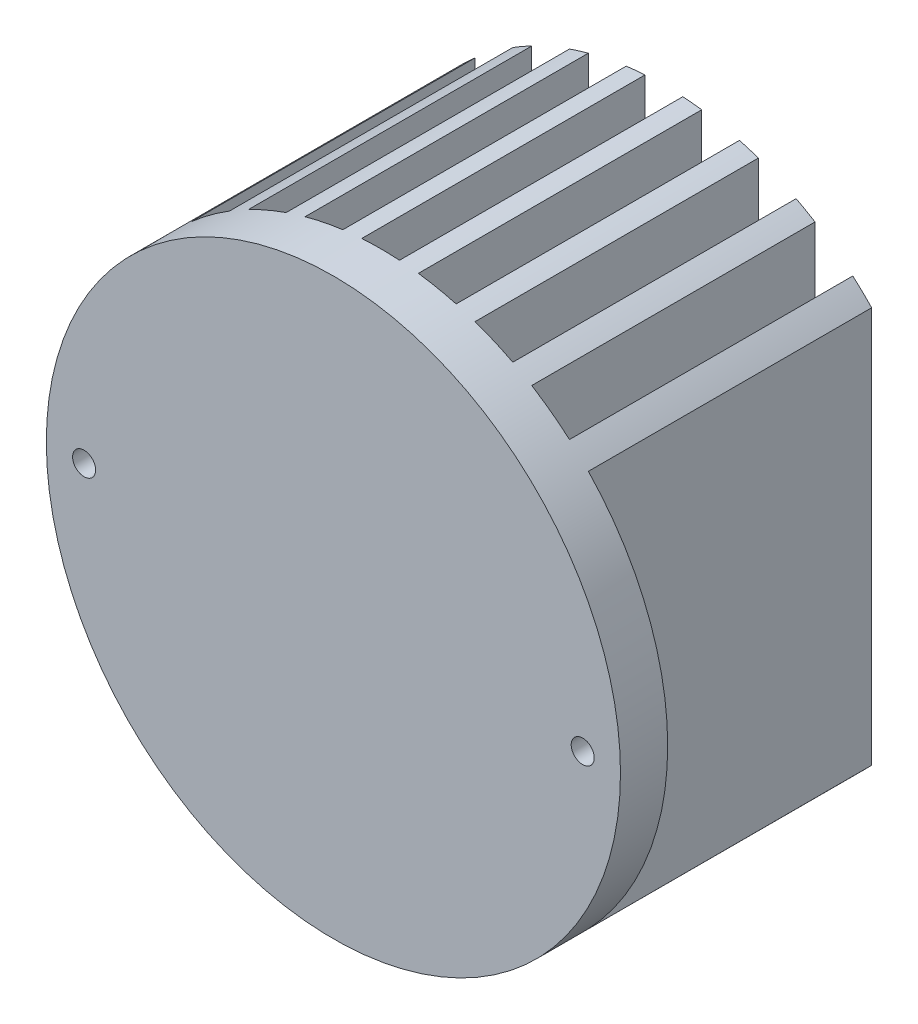
ISO-10303-21;
HEADER;
FILE_DESCRIPTION(('STEP AP214'),'2;1');
FILE_NAME('part.step','',(''),(''),'','','');
FILE_SCHEMA(('AUTOMOTIVE_DESIGN { 1 0 10303 214 1 1 1 1 }'));
ENDSEC;
DATA;
#1=APPLICATION_CONTEXT('core data for automotive mechanical design processes');
#2=APPLICATION_PROTOCOL_DEFINITION('international standard','automotive_design',2000,#1);
#3=PRODUCT_CONTEXT('',#1,'mechanical');
#4=PRODUCT('Part','Part','',(#3));
#5=PRODUCT_RELATED_PRODUCT_CATEGORY('part','',(#4));
#6=PRODUCT_DEFINITION_FORMATION('','',#4);
#7=PRODUCT_DEFINITION_CONTEXT('part definition',#1,'design');
#8=PRODUCT_DEFINITION('design','',#6,#7);
#9=PRODUCT_DEFINITION_SHAPE('','',#8);
#10=(LENGTH_UNIT() NAMED_UNIT(*) SI_UNIT(.MILLI.,.METRE.));
#11=(NAMED_UNIT(*) PLANE_ANGLE_UNIT() SI_UNIT($,.RADIAN.));
#12=(NAMED_UNIT(*) SI_UNIT($,.STERADIAN.) SOLID_ANGLE_UNIT());
#13=UNCERTAINTY_MEASURE_WITH_UNIT(LENGTH_MEASURE(1.E-05),#10,'distance_accuracy_value','');
#14=(GEOMETRIC_REPRESENTATION_CONTEXT(3) GLOBAL_UNCERTAINTY_ASSIGNED_CONTEXT((#13)) GLOBAL_UNIT_ASSIGNED_CONTEXT((#10,
#11,#12)) REPRESENTATION_CONTEXT('',''));
#15=CARTESIAN_POINT('',(0.,0.,0.));
#16=DIRECTION('',(0.,0.,1.));
#17=DIRECTION('',(1.,0.,0.));
#18=AXIS2_PLACEMENT_3D('',#15,#16,#17);
#19=CARTESIAN_POINT('',(0.,0.,35.));
#20=DIRECTION('',(0.,0.,-1.));
#21=DIRECTION('',(-1.,0.,0.));
#22=AXIS2_PLACEMENT_3D('',#19,#20,#21);
#23=CYLINDRICAL_SURFACE('',#22,30.4);
#24=CARTESIAN_POINT('',(0.,0.,35.));
#25=DIRECTION('',(0.,0.,1.));
#26=DIRECTION('',(1.,0.,0.));
#27=AXIS2_PLACEMENT_3D('',#24,#25,#26);
#28=CIRCLE('',#27,30.4);
#29=CARTESIAN_POINT('',(30.4,0.,35.));
#30=VERTEX_POINT('',#29);
#31=EDGE_CURVE('E296',#30,#30,#28,.T.);
#32=ORIENTED_EDGE('',*,*,#31,.F.);
#33=EDGE_LOOP('',(#32));
#34=FACE_BOUND('',#33,.T.);
#35=CARTESIAN_POINT('',(0.,0.,30.));
#36=DIRECTION('',(0.,0.,-1.));
#37=DIRECTION('',(-1.,0.,0.));
#38=AXIS2_PLACEMENT_3D('',#35,#36,#37);
#39=CIRCLE('',#38,30.4);
#40=CARTESIAN_POINT('',(22.,20.9799904671094,30.));
#41=VERTEX_POINT('',#40);
#42=CARTESIAN_POINT('',(22.,-20.9799904671094,30.));
#43=VERTEX_POINT('',#42);
#44=EDGE_CURVE('E338',#41,#43,#39,.T.);
#45=ORIENTED_EDGE('',*,*,#44,.F.);
#46=DIRECTION('',(0.,0.,-1.));
#47=VECTOR('',#46,1.);
#48=CARTESIAN_POINT('',(22.,20.9799904671094,35.));
#49=LINE('',#48,#47);
#50=CARTESIAN_POINT('',(22.,20.9799904671094,0.));
#51=VERTEX_POINT('',#50);
#52=EDGE_CURVE('E528',#41,#51,#49,.T.);
#53=ORIENTED_EDGE('',*,*,#52,.T.);
#54=CARTESIAN_POINT('',(0.,0.,0.));
#55=DIRECTION('',(0.,0.,1.));
#56=DIRECTION('',(1.,0.,0.));
#57=AXIS2_PLACEMENT_3D('',#54,#55,#56);
#58=CIRCLE('',#57,30.4);
#59=CARTESIAN_POINT('',(20.,22.8945408340067,0.));
#60=VERTEX_POINT('',#59);
#61=EDGE_CURVE('E444',#51,#60,#58,.T.);
#62=ORIENTED_EDGE('',*,*,#61,.T.);
#63=DIRECTION('',(0.,0.,-1.));
#64=VECTOR('',#63,1.);
#65=CARTESIAN_POINT('',(20.,22.8945408340067,35.));
#66=LINE('',#65,#64);
#67=CARTESIAN_POINT('',(20.,22.8945408340067,30.));
#68=VERTEX_POINT('',#67);
#69=EDGE_CURVE('E525',#60,#68,#66,.F.);
#70=ORIENTED_EDGE('',*,*,#69,.T.);
#71=CARTESIAN_POINT('',(0.,0.,30.));
#72=DIRECTION('',(0.,0.,-1.));
#73=DIRECTION('',(-1.,0.,0.));
#74=AXIS2_PLACEMENT_3D('',#71,#72,#73);
#75=CIRCLE('',#74,30.4);
#76=CARTESIAN_POINT('',(16.,25.8487910742456,30.));
#77=VERTEX_POINT('',#76);
#78=EDGE_CURVE('E344',#77,#68,#75,.T.);
#79=ORIENTED_EDGE('',*,*,#78,.F.);
#80=DIRECTION('',(0.,0.,-1.));
#81=VECTOR('',#80,1.);
#82=CARTESIAN_POINT('',(16.,25.8487910742456,35.));
#83=LINE('',#82,#81);
#84=CARTESIAN_POINT('',(16.,25.8487910742456,0.));
#85=VERTEX_POINT('',#84);
#86=EDGE_CURVE('E516',#77,#85,#83,.T.);
#87=ORIENTED_EDGE('',*,*,#86,.T.);
#88=CARTESIAN_POINT('',(14.,26.9844399608367,0.));
#89=VERTEX_POINT('',#88);
#90=EDGE_CURVE('E450',#85,#89,#58,.T.);
#91=ORIENTED_EDGE('',*,*,#90,.T.);
#92=DIRECTION('',(0.,0.,-1.));
#93=VECTOR('',#92,1.);
#94=CARTESIAN_POINT('',(14.,26.9844399608367,35.));
#95=LINE('',#94,#93);
#96=CARTESIAN_POINT('',(14.,26.9844399608367,30.));
#97=VERTEX_POINT('',#96);
#98=EDGE_CURVE('E513',#89,#97,#95,.F.);
#99=ORIENTED_EDGE('',*,*,#98,.T.);
#100=CARTESIAN_POINT('',(0.,0.,30.));
#101=DIRECTION('',(0.,0.,-1.));
#102=DIRECTION('',(-1.,0.,0.));
#103=AXIS2_PLACEMENT_3D('',#100,#101,#102);
#104=CIRCLE('',#103,30.4);
#105=CARTESIAN_POINT('',(10.,28.708186985597,30.));
#106=VERTEX_POINT('',#105);
#107=EDGE_CURVE('E348',#106,#97,#104,.T.);
#108=ORIENTED_EDGE('',*,*,#107,.F.);
#109=DIRECTION('',(0.,0.,-1.));
#110=VECTOR('',#109,1.);
#111=CARTESIAN_POINT('',(10.,28.708186985597,35.));
#112=LINE('',#111,#110);
#113=CARTESIAN_POINT('',(10.,28.708186985597,0.));
#114=VERTEX_POINT('',#113);
#115=EDGE_CURVE('E504',#106,#114,#112,.T.);
#116=ORIENTED_EDGE('',*,*,#115,.T.);
#117=CARTESIAN_POINT('',(8.,29.3284844477174,0.));
#118=VERTEX_POINT('',#117);
#119=EDGE_CURVE('E456',#114,#118,#58,.T.);
#120=ORIENTED_EDGE('',*,*,#119,.T.);
#121=DIRECTION('',(0.,0.,-1.));
#122=VECTOR('',#121,1.);
#123=CARTESIAN_POINT('',(8.,29.3284844477174,35.));
#124=LINE('',#123,#122);
#125=CARTESIAN_POINT('',(8.,29.3284844477174,30.));
#126=VERTEX_POINT('',#125);
#127=EDGE_CURVE('E501',#118,#126,#124,.F.);
#128=ORIENTED_EDGE('',*,*,#127,.T.);
#129=CARTESIAN_POINT('',(0.,0.,30.));
#130=DIRECTION('',(0.,0.,-1.));
#131=DIRECTION('',(-1.,0.,0.));
#132=AXIS2_PLACEMENT_3D('',#129,#130,#131);
#133=CIRCLE('',#132,30.4);
#134=CARTESIAN_POINT('',(4.,30.1356931229398,30.));
#135=VERTEX_POINT('',#134);
#136=EDGE_CURVE('E352',#135,#126,#133,.T.);
#137=ORIENTED_EDGE('',*,*,#136,.F.);
#138=DIRECTION('',(0.,0.,-1.));
#139=VECTOR('',#138,1.);
#140=CARTESIAN_POINT('',(4.,30.1356931229398,35.));
#141=LINE('',#140,#139);
#142=CARTESIAN_POINT('',(4.,30.1356931229398,0.));
#143=VERTEX_POINT('',#142);
#144=EDGE_CURVE('E491',#135,#143,#141,.T.);
#145=ORIENTED_EDGE('',*,*,#144,.T.);
#146=CARTESIAN_POINT('',(2.,30.3341391834349,0.));
#147=VERTEX_POINT('',#146);
#148=EDGE_CURVE('E429',#143,#147,#58,.T.);
#149=ORIENTED_EDGE('',*,*,#148,.T.);
#150=DIRECTION('',(0.,0.,-1.));
#151=VECTOR('',#150,1.);
#152=CARTESIAN_POINT('',(2.,30.3341391834349,35.));
#153=LINE('',#152,#151);
#154=CARTESIAN_POINT('',(2.,30.3341391834349,30.));
#155=VERTEX_POINT('',#154);
#156=EDGE_CURVE('E480',#147,#155,#153,.F.);
#157=ORIENTED_EDGE('',*,*,#156,.T.);
#158=CARTESIAN_POINT('',(0.,0.,30.));
#159=DIRECTION('',(0.,0.,-1.));
#160=DIRECTION('',(-1.,0.,0.));
#161=AXIS2_PLACEMENT_3D('',#158,#159,#160);
#162=CIRCLE('',#161,30.4);
#163=CARTESIAN_POINT('',(-2.,30.3341391834349,30.));
#164=VERTEX_POINT('',#163);
#165=EDGE_CURVE('E309',#164,#155,#162,.T.);
#166=ORIENTED_EDGE('',*,*,#165,.F.);
#167=DIRECTION('',(0.,0.,-1.));
#168=VECTOR('',#167,1.);
#169=CARTESIAN_POINT('',(-2.,30.3341391834349,35.));
#170=LINE('',#169,#168);
#171=CARTESIAN_POINT('',(-2.,30.3341391834349,0.));
#172=VERTEX_POINT('',#171);
#173=EDGE_CURVE('E421',#164,#172,#170,.T.);
#174=ORIENTED_EDGE('',*,*,#173,.T.);
#175=CARTESIAN_POINT('',(-4.,30.1356931229398,0.));
#176=VERTEX_POINT('',#175);
#177=EDGE_CURVE('E295',#172,#176,#58,.T.);
#178=ORIENTED_EDGE('',*,*,#177,.T.);
#179=DIRECTION('',(0.,0.,-1.));
#180=VECTOR('',#179,1.);
#181=CARTESIAN_POINT('',(-4.,30.1356931229398,35.));
#182=LINE('',#181,#180);
#183=CARTESIAN_POINT('',(-4.,30.1356931229398,30.));
#184=VERTEX_POINT('',#183);
#185=EDGE_CURVE('E11',#184,#176,#182,.T.);
#186=ORIENTED_EDGE('',*,*,#185,.F.);
#187=CARTESIAN_POINT('',(0.,0.,30.));
#188=DIRECTION('',(0.,0.,-1.));
#189=DIRECTION('',(-1.,0.,0.));
#190=AXIS2_PLACEMENT_3D('',#187,#188,#189);
#191=CIRCLE('',#190,30.4);
#192=CARTESIAN_POINT('',(-8.,29.3284844477174,30.));
#193=VERTEX_POINT('',#192);
#194=EDGE_CURVE('E394',#193,#184,#191,.T.);
#195=ORIENTED_EDGE('',*,*,#194,.F.);
#196=DIRECTION('',(0.,0.,-1.));
#197=VECTOR('',#196,1.);
#198=CARTESIAN_POINT('',(-8.,29.3284844477174,35.));
#199=LINE('',#198,#197);
#200=CARTESIAN_POINT('',(-8.,29.3284844477174,0.));
#201=VERTEX_POINT('',#200);
#202=EDGE_CURVE('E53',#201,#193,#199,.F.);
#203=ORIENTED_EDGE('',*,*,#202,.F.);
#204=CARTESIAN_POINT('',(-10.,28.708186985597,0.));
#205=VERTEX_POINT('',#204);
#206=EDGE_CURVE('E424',#201,#205,#58,.T.);
#207=ORIENTED_EDGE('',*,*,#206,.T.);
#208=DIRECTION('',(0.,0.,-1.));
#209=VECTOR('',#208,1.);
#210=CARTESIAN_POINT('',(-10.,28.708186985597,35.));
#211=LINE('',#210,#209);
#212=CARTESIAN_POINT('',(-10.,28.708186985597,30.));
#213=VERTEX_POINT('',#212);
#214=EDGE_CURVE('E387',#213,#205,#211,.T.);
#215=ORIENTED_EDGE('',*,*,#214,.F.);
#216=CARTESIAN_POINT('',(0.,0.,30.));
#217=DIRECTION('',(0.,0.,-1.));
#218=DIRECTION('',(-1.,0.,0.));
#219=AXIS2_PLACEMENT_3D('',#216,#217,#218);
#220=CIRCLE('',#219,30.4);
#221=CARTESIAN_POINT('',(-14.,26.9844399608367,30.));
#222=VERTEX_POINT('',#221);
#223=EDGE_CURVE('E378',#222,#213,#220,.T.);
#224=ORIENTED_EDGE('',*,*,#223,.F.);
#225=DIRECTION('',(0.,0.,-1.));
#226=VECTOR('',#225,1.);
#227=CARTESIAN_POINT('',(-14.,26.9844399608367,35.));
#228=LINE('',#227,#226);
#229=CARTESIAN_POINT('',(-14.,26.9844399608367,0.));
#230=VERTEX_POINT('',#229);
#231=EDGE_CURVE('E384',#230,#222,#228,.F.);
#232=ORIENTED_EDGE('',*,*,#231,.F.);
#233=CARTESIAN_POINT('',(-16.,25.8487910742456,0.));
#234=VERTEX_POINT('',#233);
#235=EDGE_CURVE('E285',#230,#234,#58,.T.);
#236=ORIENTED_EDGE('',*,*,#235,.T.);
#237=DIRECTION('',(0.,0.,-1.));
#238=VECTOR('',#237,1.);
#239=CARTESIAN_POINT('',(-16.,25.8487910742456,35.));
#240=LINE('',#239,#238);
#241=CARTESIAN_POINT('',(-16.,25.8487910742456,30.));
#242=VERTEX_POINT('',#241);
#243=EDGE_CURVE('E371',#242,#234,#240,.T.);
#244=ORIENTED_EDGE('',*,*,#243,.F.);
#245=CARTESIAN_POINT('',(0.,0.,30.));
#246=DIRECTION('',(0.,0.,-1.));
#247=DIRECTION('',(-1.,0.,0.));
#248=AXIS2_PLACEMENT_3D('',#245,#246,#247);
#249=CIRCLE('',#248,30.4);
#250=CARTESIAN_POINT('',(-20.,22.8945408340067,30.));
#251=VERTEX_POINT('',#250);
#252=EDGE_CURVE('E361',#251,#242,#249,.T.);
#253=ORIENTED_EDGE('',*,*,#252,.F.);
#254=DIRECTION('',(0.,0.,-1.));
#255=VECTOR('',#254,1.);
#256=CARTESIAN_POINT('',(-20.,22.8945408340067,35.));
#257=LINE('',#256,#255);
#258=CARTESIAN_POINT('',(-20.,22.8945408340067,0.));
#259=VERTEX_POINT('',#258);
#260=EDGE_CURVE('E368',#259,#251,#257,.F.);
#261=ORIENTED_EDGE('',*,*,#260,.F.);
#262=CARTESIAN_POINT('',(-22.,20.9799904671094,0.));
#263=VERTEX_POINT('',#262);
#264=EDGE_CURVE('E280',#259,#263,#58,.T.);
#265=ORIENTED_EDGE('',*,*,#264,.T.);
#266=DIRECTION('',(0.,0.,-1.));
#267=VECTOR('',#266,1.);
#268=CARTESIAN_POINT('',(-22.,20.9799904671094,35.));
#269=LINE('',#268,#267);
#270=CARTESIAN_POINT('',(-22.,20.9799904671094,30.));
#271=VERTEX_POINT('',#270);
#272=EDGE_CURVE('E260',#271,#263,#269,.T.);
#273=ORIENTED_EDGE('',*,*,#272,.F.);
#274=CARTESIAN_POINT('',(0.,0.,30.));
#275=DIRECTION('',(0.,0.,-1.));
#276=DIRECTION('',(-1.,0.,0.));
#277=AXIS2_PLACEMENT_3D('',#274,#275,#276);
#278=CIRCLE('',#277,30.4);
#279=CARTESIAN_POINT('',(-22.,-20.9799904671094,30.));
#280=VERTEX_POINT('',#279);
#281=EDGE_CURVE('E273',#280,#271,#278,.T.);
#282=ORIENTED_EDGE('',*,*,#281,.F.);
#283=DIRECTION('',(0.,0.,-1.));
#284=VECTOR('',#283,1.);
#285=CARTESIAN_POINT('',(-22.,-20.9799904671094,35.));
#286=LINE('',#285,#284);
#287=CARTESIAN_POINT('',(-22.,-20.9799904671094,0.));
#288=VERTEX_POINT('',#287);
#289=EDGE_CURVE('E257',#288,#280,#286,.F.);
#290=ORIENTED_EDGE('',*,*,#289,.F.);
#291=CARTESIAN_POINT('',(-20.,-22.8945408340067,0.));
#292=VERTEX_POINT('',#291);
#293=EDGE_CURVE('E272',#288,#292,#58,.T.);
#294=ORIENTED_EDGE('',*,*,#293,.T.);
#295=DIRECTION('',(0.,0.,-1.));
#296=VECTOR('',#295,1.);
#297=CARTESIAN_POINT('',(-20.,-22.8945408340067,35.));
#298=LINE('',#297,#296);
#299=CARTESIAN_POINT('',(-20.,-22.8945408340067,30.));
#300=VERTEX_POINT('',#299);
#301=EDGE_CURVE('E360',#300,#292,#298,.T.);
#302=ORIENTED_EDGE('',*,*,#301,.F.);
#303=CARTESIAN_POINT('',(-16.,-25.8487910742456,30.));
#304=VERTEX_POINT('',#303);
#305=EDGE_CURVE('E357',#304,#300,#249,.T.);
#306=ORIENTED_EDGE('',*,*,#305,.F.);
#307=DIRECTION('',(0.,0.,-1.));
#308=VECTOR('',#307,1.);
#309=CARTESIAN_POINT('',(-16.,-25.8487910742456,35.));
#310=LINE('',#309,#308);
#311=CARTESIAN_POINT('',(-16.,-25.8487910742456,0.));
#312=VERTEX_POINT('',#311);
#313=EDGE_CURVE('E364',#312,#304,#310,.F.);
#314=ORIENTED_EDGE('',*,*,#313,.F.);
#315=CARTESIAN_POINT('',(-14.,-26.9844399608367,0.));
#316=VERTEX_POINT('',#315);
#317=EDGE_CURVE('E281',#312,#316,#58,.T.);
#318=ORIENTED_EDGE('',*,*,#317,.T.);
#319=DIRECTION('',(0.,0.,-1.));
#320=VECTOR('',#319,1.);
#321=CARTESIAN_POINT('',(-14.,-26.9844399608367,35.));
#322=LINE('',#321,#320);
#323=CARTESIAN_POINT('',(-14.,-26.9844399608367,30.));
#324=VERTEX_POINT('',#323);
#325=EDGE_CURVE('E377',#324,#316,#322,.T.);
#326=ORIENTED_EDGE('',*,*,#325,.F.);
#327=CARTESIAN_POINT('',(-10.,-28.708186985597,30.));
#328=VERTEX_POINT('',#327);
#329=EDGE_CURVE('E374',#328,#324,#220,.T.);
#330=ORIENTED_EDGE('',*,*,#329,.F.);
#331=DIRECTION('',(0.,0.,-1.));
#332=VECTOR('',#331,1.);
#333=CARTESIAN_POINT('',(-10.,-28.708186985597,35.));
#334=LINE('',#333,#332);
#335=CARTESIAN_POINT('',(-10.,-28.708186985597,0.));
#336=VERTEX_POINT('',#335);
#337=EDGE_CURVE('E381',#336,#328,#334,.F.);
#338=ORIENTED_EDGE('',*,*,#337,.F.);
#339=CARTESIAN_POINT('',(-8.,-29.3284844477174,0.));
#340=VERTEX_POINT('',#339);
#341=EDGE_CURVE('E287',#336,#340,#58,.T.);
#342=ORIENTED_EDGE('',*,*,#341,.T.);
#343=DIRECTION('',(0.,0.,-1.));
#344=VECTOR('',#343,1.);
#345=CARTESIAN_POINT('',(-8.,-29.3284844477174,35.));
#346=LINE('',#345,#344);
#347=CARTESIAN_POINT('',(-8.,-29.3284844477174,30.));
#348=VERTEX_POINT('',#347);
#349=EDGE_CURVE('E393',#348,#340,#346,.T.);
#350=ORIENTED_EDGE('',*,*,#349,.F.);
#351=CARTESIAN_POINT('',(-4.,-30.1356931229398,30.));
#352=VERTEX_POINT('',#351);
#353=EDGE_CURVE('E390',#352,#348,#191,.T.);
#354=ORIENTED_EDGE('',*,*,#353,.F.);
#355=DIRECTION('',(0.,0.,-1.));
#356=VECTOR('',#355,1.);
#357=CARTESIAN_POINT('',(-4.,-30.1356931229398,35.));
#358=LINE('',#357,#356);
#359=CARTESIAN_POINT('',(-4.,-30.1356931229398,0.));
#360=VERTEX_POINT('',#359);
#361=EDGE_CURVE('E397',#360,#352,#358,.F.);
#362=ORIENTED_EDGE('',*,*,#361,.F.);
#363=CARTESIAN_POINT('',(-2.,-30.3341391834349,0.));
#364=VERTEX_POINT('',#363);
#365=EDGE_CURVE('E293',#360,#364,#58,.T.);
#366=ORIENTED_EDGE('',*,*,#365,.T.);
#367=DIRECTION('',(0.,0.,-1.));
#368=VECTOR('',#367,1.);
#369=CARTESIAN_POINT('',(-2.,-30.3341391834349,35.));
#370=LINE('',#369,#368);
#371=CARTESIAN_POINT('',(-2.,-30.3341391834349,30.));
#372=VERTEX_POINT('',#371);
#373=EDGE_CURVE('E471',#364,#372,#370,.F.);
#374=ORIENTED_EDGE('',*,*,#373,.T.);
#375=CARTESIAN_POINT('',(2.,-30.3341391834349,30.));
#376=VERTEX_POINT('',#375);
#377=EDGE_CURVE('E306',#376,#372,#162,.T.);
#378=ORIENTED_EDGE('',*,*,#377,.F.);
#379=DIRECTION('',(0.,0.,-1.));
#380=VECTOR('',#379,1.);
#381=CARTESIAN_POINT('',(2.,-30.3341391834349,35.));
#382=LINE('',#381,#380);
#383=CARTESIAN_POINT('',(2.,-30.3341391834349,0.));
#384=VERTEX_POINT('',#383);
#385=EDGE_CURVE('E474',#376,#384,#382,.T.);
#386=ORIENTED_EDGE('',*,*,#385,.T.);
#387=CARTESIAN_POINT('',(4.,-30.1356931229398,0.));
#388=VERTEX_POINT('',#387);
#389=EDGE_CURVE('E288',#384,#388,#58,.T.);
#390=ORIENTED_EDGE('',*,*,#389,.T.);
#391=DIRECTION('',(0.,0.,-1.));
#392=VECTOR('',#391,1.);
#393=CARTESIAN_POINT('',(4.,-30.1356931229398,35.));
#394=LINE('',#393,#392);
#395=CARTESIAN_POINT('',(4.,-30.1356931229398,30.));
#396=VERTEX_POINT('',#395);
#397=EDGE_CURVE('E494',#388,#396,#394,.F.);
#398=ORIENTED_EDGE('',*,*,#397,.T.);
#399=CARTESIAN_POINT('',(8.,-29.3284844477174,30.));
#400=VERTEX_POINT('',#399);
#401=EDGE_CURVE('E349',#400,#396,#133,.T.);
#402=ORIENTED_EDGE('',*,*,#401,.F.);
#403=DIRECTION('',(0.,0.,-1.));
#404=VECTOR('',#403,1.);
#405=CARTESIAN_POINT('',(8.,-29.3284844477174,35.));
#406=LINE('',#405,#404);
#407=CARTESIAN_POINT('',(8.,-29.3284844477174,0.));
#408=VERTEX_POINT('',#407);
#409=EDGE_CURVE('E498',#400,#408,#406,.T.);
#410=ORIENTED_EDGE('',*,*,#409,.T.);
#411=CARTESIAN_POINT('',(10.,-28.708186985597,0.));
#412=VERTEX_POINT('',#411);
#413=EDGE_CURVE('E294',#408,#412,#58,.T.);
#414=ORIENTED_EDGE('',*,*,#413,.T.);
#415=DIRECTION('',(0.,0.,-1.));
#416=VECTOR('',#415,1.);
#417=CARTESIAN_POINT('',(10.,-28.708186985597,35.));
#418=LINE('',#417,#416);
#419=CARTESIAN_POINT('',(10.,-28.708186985597,30.));
#420=VERTEX_POINT('',#419);
#421=EDGE_CURVE('E507',#412,#420,#418,.F.);
#422=ORIENTED_EDGE('',*,*,#421,.T.);
#423=CARTESIAN_POINT('',(14.,-26.9844399608367,30.));
#424=VERTEX_POINT('',#423);
#425=EDGE_CURVE('E345',#424,#420,#104,.T.);
#426=ORIENTED_EDGE('',*,*,#425,.F.);
#427=DIRECTION('',(0.,0.,-1.));
#428=VECTOR('',#427,1.);
#429=CARTESIAN_POINT('',(14.,-26.9844399608367,35.));
#430=LINE('',#429,#428);
#431=CARTESIAN_POINT('',(14.,-26.9844399608367,0.));
#432=VERTEX_POINT('',#431);
#433=EDGE_CURVE('E510',#424,#432,#430,.T.);
#434=ORIENTED_EDGE('',*,*,#433,.T.);
#435=CARTESIAN_POINT('',(16.,-25.8487910742456,0.));
#436=VERTEX_POINT('',#435);
#437=EDGE_CURVE('E432',#432,#436,#58,.T.);
#438=ORIENTED_EDGE('',*,*,#437,.T.);
#439=DIRECTION('',(0.,0.,-1.));
#440=VECTOR('',#439,1.);
#441=CARTESIAN_POINT('',(16.,-25.8487910742456,35.));
#442=LINE('',#441,#440);
#443=CARTESIAN_POINT('',(16.,-25.8487910742456,30.));
#444=VERTEX_POINT('',#443);
#445=EDGE_CURVE('E519',#436,#444,#442,.F.);
#446=ORIENTED_EDGE('',*,*,#445,.T.);
#447=CARTESIAN_POINT('',(20.,-22.8945408340067,30.));
#448=VERTEX_POINT('',#447);
#449=EDGE_CURVE('E341',#448,#444,#75,.T.);
#450=ORIENTED_EDGE('',*,*,#449,.F.);
#451=DIRECTION('',(0.,0.,-1.));
#452=VECTOR('',#451,1.);
#453=CARTESIAN_POINT('',(20.,-22.8945408340067,35.));
#454=LINE('',#453,#452);
#455=CARTESIAN_POINT('',(20.,-22.8945408340067,0.));
#456=VERTEX_POINT('',#455);
#457=EDGE_CURVE('E522',#448,#456,#454,.T.);
#458=ORIENTED_EDGE('',*,*,#457,.T.);
#459=CARTESIAN_POINT('',(22.,-20.9799904671094,0.));
#460=VERTEX_POINT('',#459);
#461=EDGE_CURVE('E438',#456,#460,#58,.T.);
#462=ORIENTED_EDGE('',*,*,#461,.T.);
#463=DIRECTION('',(0.,0.,-1.));
#464=VECTOR('',#463,1.);
#465=CARTESIAN_POINT('',(22.,-20.9799904671094,35.));
#466=LINE('',#465,#464);
#467=EDGE_CURVE('E531',#460,#43,#466,.F.);
#468=ORIENTED_EDGE('',*,*,#467,.T.);
#469=EDGE_LOOP('',(#45,#53,#62,#70,#79,#87,#91,#99,#108,#116,#120,#128,#137,#145,#149,#157,#166,
#174,#178,#186,#195,#203,#207,#215,#224,#232,#236,#244,#253,#261,#265,#273,#282,#290,#294,#302,
#306,#314,#318,#326,#330,#338,#342,#350,#354,#362,#366,#374,#378,#386,#390,#398,#402,#410,#414,
#422,#426,#434,#438,#446,#450,#458,#462,#468));
#470=FACE_BOUND('',#469,.T.);
#471=ADVANCED_FACE('F45',(#34,#470),#23,.T.);
#472=CARTESIAN_POINT('',(0.,0.,0.));
#473=DIRECTION('',(0.,0.,1.));
#474=DIRECTION('',(1.,0.,0.));
#475=AXIS2_PLACEMENT_3D('',#472,#473,#474);
#476=PLANE('',#475);
#477=DIRECTION('',(0.,1.,0.));
#478=VECTOR('',#477,1.);
#479=CARTESIAN_POINT('',(-4.,-30.4,0.));
#480=LINE('',#479,#478);
#481=EDGE_CURVE('E590',#360,#176,#480,.T.);
#482=ORIENTED_EDGE('',*,*,#481,.T.);
#483=ORIENTED_EDGE('',*,*,#177,.F.);
#484=DIRECTION('',(0.,-1.,0.));
#485=VECTOR('',#484,1.);
#486=CARTESIAN_POINT('',(-2.,0.,0.));
#487=LINE('',#486,#485);
#488=EDGE_CURVE('E302',#172,#364,#487,.T.);
#489=ORIENTED_EDGE('',*,*,#488,.T.);
#490=ORIENTED_EDGE('',*,*,#365,.F.);
#491=EDGE_LOOP('',(#482,#483,#489,#490));
#492=FACE_BOUND('',#491,.T.);
#493=ADVANCED_FACE('F733',(#492),#476,.F.);
#494=DIRECTION('',(0.,-1.,0.));
#495=VECTOR('',#494,1.);
#496=CARTESIAN_POINT('',(-8.,-30.4,0.));
#497=LINE('',#496,#495);
#498=EDGE_CURVE('E415',#201,#340,#497,.T.);
#499=ORIENTED_EDGE('',*,*,#498,.T.);
#500=ORIENTED_EDGE('',*,*,#341,.F.);
#501=DIRECTION('',(0.,1.,0.));
#502=VECTOR('',#501,1.);
#503=CARTESIAN_POINT('',(-10.,-30.4,0.));
#504=LINE('',#503,#502);
#505=EDGE_CURVE('E575',#336,#205,#504,.T.);
#506=ORIENTED_EDGE('',*,*,#505,.T.);
#507=ORIENTED_EDGE('',*,*,#206,.F.);
#508=EDGE_LOOP('',(#499,#500,#506,#507));
#509=FACE_BOUND('',#508,.T.);
#510=ADVANCED_FACE('F738',(#509),#476,.F.);
#511=DIRECTION('',(0.,-1.,0.));
#512=VECTOR('',#511,1.);
#513=CARTESIAN_POINT('',(-14.,-30.4,0.));
#514=LINE('',#513,#512);
#515=EDGE_CURVE('E579',#230,#316,#514,.T.);
#516=ORIENTED_EDGE('',*,*,#515,.T.);
#517=ORIENTED_EDGE('',*,*,#317,.F.);
#518=DIRECTION('',(0.,1.,0.));
#519=VECTOR('',#518,1.);
#520=CARTESIAN_POINT('',(-16.,-30.4,0.));
#521=LINE('',#520,#519);
#522=EDGE_CURVE('E564',#312,#234,#521,.T.);
#523=ORIENTED_EDGE('',*,*,#522,.T.);
#524=ORIENTED_EDGE('',*,*,#235,.F.);
#525=EDGE_LOOP('',(#516,#517,#523,#524));
#526=FACE_BOUND('',#525,.T.);
#527=ADVANCED_FACE('F653',(#526),#476,.F.);
#528=DIRECTION('',(0.,-1.,0.));
#529=VECTOR('',#528,1.);
#530=CARTESIAN_POINT('',(-20.,-30.4,0.));
#531=LINE('',#530,#529);
#532=EDGE_CURVE('E278',#259,#292,#531,.T.);
#533=ORIENTED_EDGE('',*,*,#532,.T.);
#534=ORIENTED_EDGE('',*,*,#293,.F.);
#535=DIRECTION('',(0.,1.,0.));
#536=VECTOR('',#535,1.);
#537=CARTESIAN_POINT('',(-22.,-30.4,0.));
#538=LINE('',#537,#536);
#539=EDGE_CURVE('E253',#288,#263,#538,.T.);
#540=ORIENTED_EDGE('',*,*,#539,.T.);
#541=ORIENTED_EDGE('',*,*,#264,.F.);
#542=EDGE_LOOP('',(#533,#534,#540,#541));
#543=FACE_BOUND('',#542,.T.);
#544=ADVANCED_FACE('F277',(#543),#476,.F.);
#545=ORIENTED_EDGE('',*,*,#148,.F.);
#546=DIRECTION('',(0.,-1.,0.));
#547=VECTOR('',#546,1.);
#548=CARTESIAN_POINT('',(4.,0.,0.));
#549=LINE('',#548,#547);
#550=EDGE_CURVE('E334',#143,#388,#549,.T.);
#551=ORIENTED_EDGE('',*,*,#550,.T.);
#552=ORIENTED_EDGE('',*,*,#389,.F.);
#553=DIRECTION('',(0.,1.,0.));
#554=VECTOR('',#553,1.);
#555=CARTESIAN_POINT('',(2.,0.,0.));
#556=LINE('',#555,#554);
#557=EDGE_CURVE('E298',#384,#147,#556,.T.);
#558=ORIENTED_EDGE('',*,*,#557,.T.);
#559=EDGE_LOOP('',(#545,#551,#552,#558));
#560=FACE_BOUND('',#559,.T.);
#561=ADVANCED_FACE('F677',(#560),#476,.F.);
#562=ORIENTED_EDGE('',*,*,#413,.F.);
#563=DIRECTION('',(0.,1.,0.));
#564=VECTOR('',#563,1.);
#565=CARTESIAN_POINT('',(8.,0.,0.));
#566=LINE('',#565,#564);
#567=EDGE_CURVE('E330',#408,#118,#566,.T.);
#568=ORIENTED_EDGE('',*,*,#567,.T.);
#569=ORIENTED_EDGE('',*,*,#119,.F.);
#570=DIRECTION('',(0.,-1.,0.));
#571=VECTOR('',#570,1.);
#572=CARTESIAN_POINT('',(10.,0.,0.));
#573=LINE('',#572,#571);
#574=EDGE_CURVE('E326',#114,#412,#573,.T.);
#575=ORIENTED_EDGE('',*,*,#574,.T.);
#576=EDGE_LOOP('',(#562,#568,#569,#575));
#577=FACE_BOUND('',#576,.T.);
#578=ADVANCED_FACE('F689',(#577),#476,.F.);
#579=ORIENTED_EDGE('',*,*,#437,.F.);
#580=DIRECTION('',(0.,1.,0.));
#581=VECTOR('',#580,1.);
#582=CARTESIAN_POINT('',(14.,0.,0.));
#583=LINE('',#582,#581);
#584=EDGE_CURVE('E322',#432,#89,#583,.T.);
#585=ORIENTED_EDGE('',*,*,#584,.T.);
#586=ORIENTED_EDGE('',*,*,#90,.F.);
#587=DIRECTION('',(0.,-1.,0.));
#588=VECTOR('',#587,1.);
#589=CARTESIAN_POINT('',(16.,0.,0.));
#590=LINE('',#589,#588);
#591=EDGE_CURVE('E318',#85,#436,#590,.T.);
#592=ORIENTED_EDGE('',*,*,#591,.T.);
#593=EDGE_LOOP('',(#579,#585,#586,#592));
#594=FACE_BOUND('',#593,.T.);
#595=ADVANCED_FACE('F701',(#594),#476,.F.);
#596=ORIENTED_EDGE('',*,*,#461,.F.);
#597=DIRECTION('',(0.,1.,0.));
#598=VECTOR('',#597,1.);
#599=CARTESIAN_POINT('',(20.,0.,0.));
#600=LINE('',#599,#598);
#601=EDGE_CURVE('E314',#456,#60,#600,.T.);
#602=ORIENTED_EDGE('',*,*,#601,.T.);
#603=ORIENTED_EDGE('',*,*,#61,.F.);
#604=DIRECTION('',(0.,-1.,0.));
#605=VECTOR('',#604,1.);
#606=CARTESIAN_POINT('',(22.,0.,0.));
#607=LINE('',#606,#605);
#608=EDGE_CURVE('E310',#51,#460,#607,.T.);
#609=ORIENTED_EDGE('',*,*,#608,.T.);
#610=EDGE_LOOP('',(#596,#602,#603,#609));
#611=FACE_BOUND('',#610,.T.);
#612=ADVANCED_FACE('F713',(#611),#476,.F.);
#613=CARTESIAN_POINT('',(0.,0.,35.));
#614=DIRECTION('',(0.,0.,1.));
#615=DIRECTION('',(1.,0.,0.));
#616=AXIS2_PLACEMENT_3D('',#613,#614,#615);
#617=PLANE('',#616);
#618=CARTESIAN_POINT('',(-26.4,0.,35.));
#619=DIRECTION('',(0.,0.,-1.));
#620=DIRECTION('',(-1.,0.,0.));
#621=AXIS2_PLACEMENT_3D('',#618,#619,#620);
#622=CIRCLE('',#621,1.2192);
#623=CARTESIAN_POINT('',(-27.6192,0.,35.));
#624=VERTEX_POINT('',#623);
#625=EDGE_CURVE('E615',#624,#624,#622,.T.);
#626=ORIENTED_EDGE('',*,*,#625,.T.);
#627=EDGE_LOOP('',(#626));
#628=FACE_BOUND('',#627,.T.);
#629=CARTESIAN_POINT('',(26.4,0.,35.));
#630=DIRECTION('',(0.,0.,-1.));
#631=DIRECTION('',(-1.,0.,0.));
#632=AXIS2_PLACEMENT_3D('',#629,#630,#631);
#633=CIRCLE('',#632,1.2192);
#634=CARTESIAN_POINT('',(25.1808,0.,35.));
#635=VERTEX_POINT('',#634);
#636=EDGE_CURVE('E267',#635,#635,#633,.T.);
#637=ORIENTED_EDGE('',*,*,#636,.T.);
#638=EDGE_LOOP('',(#637));
#639=FACE_BOUND('',#638,.T.);
#640=ORIENTED_EDGE('',*,*,#31,.T.);
#641=EDGE_LOOP('',(#640));
#642=FACE_BOUND('',#641,.T.);
#643=ADVANCED_FACE('F741',(#628,#639,#642),#617,.T.);
#644=CARTESIAN_POINT('',(0.,0.,30.));
#645=DIRECTION('',(0.,0.,-1.));
#646=DIRECTION('',(-1.,0.,0.));
#647=AXIS2_PLACEMENT_3D('',#644,#645,#646);
#648=PLANE('',#647);
#649=DIRECTION('',(0.,1.,0.));
#650=VECTOR('',#649,1.);
#651=CARTESIAN_POINT('',(-2.,-30.4,30.));
#652=LINE('',#651,#650);
#653=EDGE_CURVE('E487',#372,#164,#652,.T.);
#654=ORIENTED_EDGE('',*,*,#653,.T.);
#655=ORIENTED_EDGE('',*,*,#165,.T.);
#656=DIRECTION('',(0.,-1.,0.));
#657=VECTOR('',#656,1.);
#658=CARTESIAN_POINT('',(2.,-30.4,30.));
#659=LINE('',#658,#657);
#660=EDGE_CURVE('E483',#155,#376,#659,.T.);
#661=ORIENTED_EDGE('',*,*,#660,.T.);
#662=ORIENTED_EDGE('',*,*,#377,.T.);
#663=EDGE_LOOP('',(#654,#655,#661,#662));
#664=FACE_BOUND('',#663,.T.);
#665=ADVANCED_FACE('F670',(#664),#648,.T.);
#666=CARTESIAN_POINT('',(-2.,-30.4,30.));
#667=DIRECTION('',(-1.,0.,0.));
#668=DIRECTION('',(0.,0.,1.));
#669=AXIS2_PLACEMENT_3D('',#666,#667,#668);
#670=PLANE('',#669);
#671=ORIENTED_EDGE('',*,*,#653,.F.);
#672=ORIENTED_EDGE('',*,*,#373,.F.);
#673=ORIENTED_EDGE('',*,*,#488,.F.);
#674=ORIENTED_EDGE('',*,*,#173,.F.);
#675=EDGE_LOOP('',(#671,#672,#673,#674));
#676=FACE_BOUND('',#675,.T.);
#677=ADVANCED_FACE('F728',(#676),#670,.F.);
#678=CARTESIAN_POINT('',(2.,-30.4,30.));
#679=DIRECTION('',(1.,0.,0.));
#680=DIRECTION('',(0.,0.,-1.));
#681=AXIS2_PLACEMENT_3D('',#678,#679,#680);
#682=PLANE('',#681);
#683=ORIENTED_EDGE('',*,*,#660,.F.);
#684=ORIENTED_EDGE('',*,*,#156,.F.);
#685=ORIENTED_EDGE('',*,*,#557,.F.);
#686=ORIENTED_EDGE('',*,*,#385,.F.);
#687=EDGE_LOOP('',(#683,#684,#685,#686));
#688=FACE_BOUND('',#687,.T.);
#689=ADVANCED_FACE('F674',(#688),#682,.F.);
#690=CARTESIAN_POINT('',(24.,0.,30.));
#691=DIRECTION('',(0.,0.,-1.));
#692=DIRECTION('',(-1.,0.,0.));
#693=AXIS2_PLACEMENT_3D('',#690,#691,#692);
#694=PLANE('',#693);
#695=CARTESIAN_POINT('',(26.4,0.,30.));
#696=DIRECTION('',(0.,0.,-1.));
#697=DIRECTION('',(-1.,0.,0.));
#698=AXIS2_PLACEMENT_3D('',#695,#696,#697);
#699=CIRCLE('',#698,2.77875999999999);
#700=CARTESIAN_POINT('',(23.62124,0.,30.));
#701=VERTEX_POINT('',#700);
#702=EDGE_CURVE('E611',#701,#701,#699,.T.);
#703=ORIENTED_EDGE('',*,*,#702,.F.);
#704=EDGE_LOOP('',(#703));
#705=FACE_BOUND('',#704,.T.);
#706=DIRECTION('',(0.,1.,0.));
#707=VECTOR('',#706,1.);
#708=CARTESIAN_POINT('',(22.,-30.4,30.));
#709=LINE('',#708,#707);
#710=EDGE_CURVE('E535',#43,#41,#709,.T.);
#711=ORIENTED_EDGE('',*,*,#710,.T.);
#712=ORIENTED_EDGE('',*,*,#44,.T.);
#713=EDGE_LOOP('',(#711,#712));
#714=FACE_BOUND('',#713,.T.);
#715=ADVANCED_FACE('F719',(#705,#714),#694,.T.);
#716=CARTESIAN_POINT('',(22.,-30.4,30.));
#717=DIRECTION('',(-1.,0.,0.));
#718=DIRECTION('',(0.,0.,1.));
#719=AXIS2_PLACEMENT_3D('',#716,#717,#718);
#720=PLANE('',#719);
#721=ORIENTED_EDGE('',*,*,#710,.F.);
#722=ORIENTED_EDGE('',*,*,#467,.F.);
#723=ORIENTED_EDGE('',*,*,#608,.F.);
#724=ORIENTED_EDGE('',*,*,#52,.F.);
#725=EDGE_LOOP('',(#721,#722,#723,#724));
#726=FACE_BOUND('',#725,.T.);
#727=ADVANCED_FACE('F717',(#726),#720,.F.);
#728=CARTESIAN_POINT('',(18.,0.,30.));
#729=DIRECTION('',(0.,0.,-1.));
#730=DIRECTION('',(-1.,0.,0.));
#731=AXIS2_PLACEMENT_3D('',#728,#729,#730);
#732=PLANE('',#731);
#733=ORIENTED_EDGE('',*,*,#78,.T.);
#734=DIRECTION('',(0.,-1.,0.));
#735=VECTOR('',#734,1.);
#736=CARTESIAN_POINT('',(20.,-30.4,30.));
#737=LINE('',#736,#735);
#738=EDGE_CURVE('E540',#68,#448,#737,.T.);
#739=ORIENTED_EDGE('',*,*,#738,.T.);
#740=ORIENTED_EDGE('',*,*,#449,.T.);
#741=DIRECTION('',(0.,1.,0.));
#742=VECTOR('',#741,1.);
#743=CARTESIAN_POINT('',(16.,-30.4,30.));
#744=LINE('',#743,#742);
#745=EDGE_CURVE('E539',#444,#77,#744,.T.);
#746=ORIENTED_EDGE('',*,*,#745,.T.);
#747=EDGE_LOOP('',(#733,#739,#740,#746));
#748=FACE_BOUND('',#747,.T.);
#749=ADVANCED_FACE('F708',(#748),#732,.T.);
#750=CARTESIAN_POINT('',(16.,-30.4,30.));
#751=DIRECTION('',(-1.,0.,0.));
#752=DIRECTION('',(0.,0.,1.));
#753=AXIS2_PLACEMENT_3D('',#750,#751,#752);
#754=PLANE('',#753);
#755=ORIENTED_EDGE('',*,*,#745,.F.);
#756=ORIENTED_EDGE('',*,*,#445,.F.);
#757=ORIENTED_EDGE('',*,*,#591,.F.);
#758=ORIENTED_EDGE('',*,*,#86,.F.);
#759=EDGE_LOOP('',(#755,#756,#757,#758));
#760=FACE_BOUND('',#759,.T.);
#761=ADVANCED_FACE('F704',(#760),#754,.F.);
#762=CARTESIAN_POINT('',(20.,-30.4,30.));
#763=DIRECTION('',(1.,0.,0.));
#764=DIRECTION('',(0.,0.,-1.));
#765=AXIS2_PLACEMENT_3D('',#762,#763,#764);
#766=PLANE('',#765);
#767=ORIENTED_EDGE('',*,*,#738,.F.);
#768=ORIENTED_EDGE('',*,*,#69,.F.);
#769=ORIENTED_EDGE('',*,*,#601,.F.);
#770=ORIENTED_EDGE('',*,*,#457,.F.);
#771=EDGE_LOOP('',(#767,#768,#769,#770));
#772=FACE_BOUND('',#771,.T.);
#773=ADVANCED_FACE('F711',(#772),#766,.F.);
#774=CARTESIAN_POINT('',(12.,0.,30.));
#775=DIRECTION('',(0.,0.,-1.));
#776=DIRECTION('',(-1.,0.,0.));
#777=AXIS2_PLACEMENT_3D('',#774,#775,#776);
#778=PLANE('',#777);
#779=ORIENTED_EDGE('',*,*,#107,.T.);
#780=DIRECTION('',(0.,-1.,0.));
#781=VECTOR('',#780,1.);
#782=CARTESIAN_POINT('',(14.,-30.4,30.));
#783=LINE('',#782,#781);
#784=EDGE_CURVE('E548',#97,#424,#783,.T.);
#785=ORIENTED_EDGE('',*,*,#784,.T.);
#786=ORIENTED_EDGE('',*,*,#425,.T.);
#787=DIRECTION('',(0.,1.,0.));
#788=VECTOR('',#787,1.);
#789=CARTESIAN_POINT('',(10.,-30.4,30.));
#790=LINE('',#789,#788);
#791=EDGE_CURVE('E544',#420,#106,#790,.T.);
#792=ORIENTED_EDGE('',*,*,#791,.T.);
#793=EDGE_LOOP('',(#779,#785,#786,#792));
#794=FACE_BOUND('',#793,.T.);
#795=ADVANCED_FACE('F696',(#794),#778,.T.);
#796=CARTESIAN_POINT('',(10.,-30.4,30.));
#797=DIRECTION('',(-1.,0.,0.));
#798=DIRECTION('',(0.,0.,1.));
#799=AXIS2_PLACEMENT_3D('',#796,#797,#798);
#800=PLANE('',#799);
#801=ORIENTED_EDGE('',*,*,#791,.F.);
#802=ORIENTED_EDGE('',*,*,#421,.F.);
#803=ORIENTED_EDGE('',*,*,#574,.F.);
#804=ORIENTED_EDGE('',*,*,#115,.F.);
#805=EDGE_LOOP('',(#801,#802,#803,#804));
#806=FACE_BOUND('',#805,.T.);
#807=ADVANCED_FACE('F692',(#806),#800,.F.);
#808=CARTESIAN_POINT('',(14.,-30.4,30.));
#809=DIRECTION('',(1.,0.,0.));
#810=DIRECTION('',(0.,0.,-1.));
#811=AXIS2_PLACEMENT_3D('',#808,#809,#810);
#812=PLANE('',#811);
#813=ORIENTED_EDGE('',*,*,#784,.F.);
#814=ORIENTED_EDGE('',*,*,#98,.F.);
#815=ORIENTED_EDGE('',*,*,#584,.F.);
#816=ORIENTED_EDGE('',*,*,#433,.F.);
#817=EDGE_LOOP('',(#813,#814,#815,#816));
#818=FACE_BOUND('',#817,.T.);
#819=ADVANCED_FACE('F699',(#818),#812,.F.);
#820=CARTESIAN_POINT('',(6.,0.,30.));
#821=DIRECTION('',(0.,0.,-1.));
#822=DIRECTION('',(-1.,0.,0.));
#823=AXIS2_PLACEMENT_3D('',#820,#821,#822);
#824=PLANE('',#823);
#825=ORIENTED_EDGE('',*,*,#136,.T.);
#826=DIRECTION('',(0.,-1.,0.));
#827=VECTOR('',#826,1.);
#828=CARTESIAN_POINT('',(8.,-30.4,30.));
#829=LINE('',#828,#827);
#830=EDGE_CURVE('E534',#126,#400,#829,.T.);
#831=ORIENTED_EDGE('',*,*,#830,.T.);
#832=ORIENTED_EDGE('',*,*,#401,.T.);
#833=DIRECTION('',(0.,1.,0.));
#834=VECTOR('',#833,1.);
#835=CARTESIAN_POINT('',(4.,-30.4,30.));
#836=LINE('',#835,#834);
#837=EDGE_CURVE('E552',#396,#135,#836,.T.);
#838=ORIENTED_EDGE('',*,*,#837,.T.);
#839=EDGE_LOOP('',(#825,#831,#832,#838));
#840=FACE_BOUND('',#839,.T.);
#841=ADVANCED_FACE('F684',(#840),#824,.T.);
#842=CARTESIAN_POINT('',(4.,-30.4,30.));
#843=DIRECTION('',(-1.,0.,0.));
#844=DIRECTION('',(0.,0.,1.));
#845=AXIS2_PLACEMENT_3D('',#842,#843,#844);
#846=PLANE('',#845);
#847=ORIENTED_EDGE('',*,*,#837,.F.);
#848=ORIENTED_EDGE('',*,*,#397,.F.);
#849=ORIENTED_EDGE('',*,*,#550,.F.);
#850=ORIENTED_EDGE('',*,*,#144,.F.);
#851=EDGE_LOOP('',(#847,#848,#849,#850));
#852=FACE_BOUND('',#851,.T.);
#853=ADVANCED_FACE('F680',(#852),#846,.F.);
#854=CARTESIAN_POINT('',(8.,-30.4,30.));
#855=DIRECTION('',(1.,0.,0.));
#856=DIRECTION('',(0.,0.,-1.));
#857=AXIS2_PLACEMENT_3D('',#854,#855,#856);
#858=PLANE('',#857);
#859=ORIENTED_EDGE('',*,*,#830,.F.);
#860=ORIENTED_EDGE('',*,*,#127,.F.);
#861=ORIENTED_EDGE('',*,*,#567,.F.);
#862=ORIENTED_EDGE('',*,*,#409,.F.);
#863=EDGE_LOOP('',(#859,#860,#861,#862));
#864=FACE_BOUND('',#863,.T.);
#865=ADVANCED_FACE('F687',(#864),#858,.F.);
#866=CARTESIAN_POINT('',(-22.,-30.4,30.));
#867=DIRECTION('',(-1.,0.,0.));
#868=DIRECTION('',(0.,0.,1.));
#869=AXIS2_PLACEMENT_3D('',#866,#867,#868);
#870=PLANE('',#869);
#871=ORIENTED_EDGE('',*,*,#272,.T.);
#872=ORIENTED_EDGE('',*,*,#539,.F.);
#873=ORIENTED_EDGE('',*,*,#289,.T.);
#874=DIRECTION('',(0.,1.,0.));
#875=VECTOR('',#874,1.);
#876=CARTESIAN_POINT('',(-22.,-30.4,30.));
#877=LINE('',#876,#875);
#878=EDGE_CURVE('E266',#280,#271,#877,.T.);
#879=ORIENTED_EDGE('',*,*,#878,.T.);
#880=EDGE_LOOP('',(#871,#872,#873,#879));
#881=FACE_BOUND('',#880,.T.);
#882=ADVANCED_FACE('F255',(#881),#870,.T.);
#883=CARTESIAN_POINT('',(-24.,0.,30.));
#884=DIRECTION('',(0.,0.,-1.));
#885=DIRECTION('',(1.,0.,0.));
#886=AXIS2_PLACEMENT_3D('',#883,#884,#885);
#887=PLANE('',#886);
#888=CARTESIAN_POINT('',(-26.4,0.,30.));
#889=DIRECTION('',(0.,0.,-1.));
#890=DIRECTION('',(-1.,0.,0.));
#891=AXIS2_PLACEMENT_3D('',#888,#889,#890);
#892=CIRCLE('',#891,2.77875999999999);
#893=CARTESIAN_POINT('',(-29.17876,0.,30.));
#894=VERTEX_POINT('',#893);
#895=EDGE_CURVE('E627',#894,#894,#892,.T.);
#896=ORIENTED_EDGE('',*,*,#895,.F.);
#897=EDGE_LOOP('',(#896));
#898=FACE_BOUND('',#897,.T.);
#899=ORIENTED_EDGE('',*,*,#281,.T.);
#900=ORIENTED_EDGE('',*,*,#878,.F.);
#901=EDGE_LOOP('',(#899,#900));
#902=FACE_BOUND('',#901,.T.);
#903=ADVANCED_FACE('F634',(#898,#902),#887,.T.);
#904=CARTESIAN_POINT('',(-16.,-30.4,30.));
#905=DIRECTION('',(-1.,0.,0.));
#906=DIRECTION('',(0.,0.,1.));
#907=AXIS2_PLACEMENT_3D('',#904,#905,#906);
#908=PLANE('',#907);
#909=ORIENTED_EDGE('',*,*,#243,.T.);
#910=ORIENTED_EDGE('',*,*,#522,.F.);
#911=ORIENTED_EDGE('',*,*,#313,.T.);
#912=DIRECTION('',(0.,1.,0.));
#913=VECTOR('',#912,1.);
#914=CARTESIAN_POINT('',(-16.,-30.4,30.));
#915=LINE('',#914,#913);
#916=EDGE_CURVE('E567',#304,#242,#915,.T.);
#917=ORIENTED_EDGE('',*,*,#916,.T.);
#918=EDGE_LOOP('',(#909,#910,#911,#917));
#919=FACE_BOUND('',#918,.T.);
#920=ADVANCED_FACE('F637',(#919),#908,.T.);
#921=CARTESIAN_POINT('',(-20.,-30.4,30.));
#922=DIRECTION('',(1.,0.,0.));
#923=DIRECTION('',(0.,0.,-1.));
#924=AXIS2_PLACEMENT_3D('',#921,#922,#923);
#925=PLANE('',#924);
#926=ORIENTED_EDGE('',*,*,#301,.T.);
#927=ORIENTED_EDGE('',*,*,#532,.F.);
#928=ORIENTED_EDGE('',*,*,#260,.T.);
#929=DIRECTION('',(0.,-1.,0.));
#930=VECTOR('',#929,1.);
#931=CARTESIAN_POINT('',(-20.,-30.4,30.));
#932=LINE('',#931,#930);
#933=EDGE_CURVE('E571',#251,#300,#932,.T.);
#934=ORIENTED_EDGE('',*,*,#933,.T.);
#935=EDGE_LOOP('',(#926,#927,#928,#934));
#936=FACE_BOUND('',#935,.T.);
#937=ADVANCED_FACE('F644',(#936),#925,.T.);
#938=CARTESIAN_POINT('',(-18.,0.,30.));
#939=DIRECTION('',(0.,0.,-1.));
#940=DIRECTION('',(1.,0.,0.));
#941=AXIS2_PLACEMENT_3D('',#938,#939,#940);
#942=PLANE('',#941);
#943=ORIENTED_EDGE('',*,*,#252,.T.);
#944=ORIENTED_EDGE('',*,*,#916,.F.);
#945=ORIENTED_EDGE('',*,*,#305,.T.);
#946=ORIENTED_EDGE('',*,*,#933,.F.);
#947=EDGE_LOOP('',(#943,#944,#945,#946));
#948=FACE_BOUND('',#947,.T.);
#949=ADVANCED_FACE('F646',(#948),#942,.T.);
#950=CARTESIAN_POINT('',(-10.,-30.4,30.));
#951=DIRECTION('',(-1.,0.,0.));
#952=DIRECTION('',(0.,0.,1.));
#953=AXIS2_PLACEMENT_3D('',#950,#951,#952);
#954=PLANE('',#953);
#955=ORIENTED_EDGE('',*,*,#214,.T.);
#956=ORIENTED_EDGE('',*,*,#505,.F.);
#957=ORIENTED_EDGE('',*,*,#337,.T.);
#958=DIRECTION('',(0.,1.,0.));
#959=VECTOR('',#958,1.);
#960=CARTESIAN_POINT('',(-10.,-30.4,30.));
#961=LINE('',#960,#959);
#962=EDGE_CURVE('E68',#328,#213,#961,.T.);
#963=ORIENTED_EDGE('',*,*,#962,.T.);
#964=EDGE_LOOP('',(#955,#956,#957,#963));
#965=FACE_BOUND('',#964,.T.);
#966=ADVANCED_FACE('F784',(#965),#954,.T.);
#967=CARTESIAN_POINT('',(-14.,-30.4,30.));
#968=DIRECTION('',(1.,0.,0.));
#969=DIRECTION('',(0.,0.,-1.));
#970=AXIS2_PLACEMENT_3D('',#967,#968,#969);
#971=PLANE('',#970);
#972=ORIENTED_EDGE('',*,*,#325,.T.);
#973=ORIENTED_EDGE('',*,*,#515,.F.);
#974=ORIENTED_EDGE('',*,*,#231,.T.);
#975=DIRECTION('',(0.,-1.,0.));
#976=VECTOR('',#975,1.);
#977=CARTESIAN_POINT('',(-14.,-30.4,30.));
#978=LINE('',#977,#976);
#979=EDGE_CURVE('E586',#222,#324,#978,.T.);
#980=ORIENTED_EDGE('',*,*,#979,.T.);
#981=EDGE_LOOP('',(#972,#973,#974,#980));
#982=FACE_BOUND('',#981,.T.);
#983=ADVANCED_FACE('F658',(#982),#971,.T.);
#984=CARTESIAN_POINT('',(-12.,0.,30.));
#985=DIRECTION('',(0.,0.,-1.));
#986=DIRECTION('',(1.,0.,0.));
#987=AXIS2_PLACEMENT_3D('',#984,#985,#986);
#988=PLANE('',#987);
#989=ORIENTED_EDGE('',*,*,#223,.T.);
#990=ORIENTED_EDGE('',*,*,#962,.F.);
#991=ORIENTED_EDGE('',*,*,#329,.T.);
#992=ORIENTED_EDGE('',*,*,#979,.F.);
#993=EDGE_LOOP('',(#989,#990,#991,#992));
#994=FACE_BOUND('',#993,.T.);
#995=ADVANCED_FACE('F776',(#994),#988,.T.);
#996=CARTESIAN_POINT('',(-4.,-30.4,30.));
#997=DIRECTION('',(-1.,0.,0.));
#998=DIRECTION('',(0.,0.,1.));
#999=AXIS2_PLACEMENT_3D('',#996,#997,#998);
#1000=PLANE('',#999);
#1001=ORIENTED_EDGE('',*,*,#185,.T.);
#1002=ORIENTED_EDGE('',*,*,#481,.F.);
#1003=ORIENTED_EDGE('',*,*,#361,.T.);
#1004=DIRECTION('',(0.,1.,0.));
#1005=VECTOR('',#1004,1.);
#1006=CARTESIAN_POINT('',(-4.,-30.4,30.));
#1007=LINE('',#1006,#1005);
#1008=EDGE_CURVE('E60',#352,#184,#1007,.T.);
#1009=ORIENTED_EDGE('',*,*,#1008,.T.);
#1010=EDGE_LOOP('',(#1001,#1002,#1003,#1009));
#1011=FACE_BOUND('',#1010,.T.);
#1012=ADVANCED_FACE('F410',(#1011),#1000,.T.);
#1013=CARTESIAN_POINT('',(-8.,-30.4,30.));
#1014=DIRECTION('',(1.,0.,0.));
#1015=DIRECTION('',(0.,0.,-1.));
#1016=AXIS2_PLACEMENT_3D('',#1013,#1014,#1015);
#1017=PLANE('',#1016);
#1018=ORIENTED_EDGE('',*,*,#349,.T.);
#1019=ORIENTED_EDGE('',*,*,#498,.F.);
#1020=ORIENTED_EDGE('',*,*,#202,.T.);
#1021=DIRECTION('',(0.,-1.,0.));
#1022=VECTOR('',#1021,1.);
#1023=CARTESIAN_POINT('',(-8.,-30.4,30.));
#1024=LINE('',#1023,#1022);
#1025=EDGE_CURVE('E407',#193,#348,#1024,.T.);
#1026=ORIENTED_EDGE('',*,*,#1025,.T.);
#1027=EDGE_LOOP('',(#1018,#1019,#1020,#1026));
#1028=FACE_BOUND('',#1027,.T.);
#1029=ADVANCED_FACE('F767',(#1028),#1017,.T.);
#1030=CARTESIAN_POINT('',(-6.,0.,30.));
#1031=DIRECTION('',(0.,0.,-1.));
#1032=DIRECTION('',(1.,0.,0.));
#1033=AXIS2_PLACEMENT_3D('',#1030,#1031,#1032);
#1034=PLANE('',#1033);
#1035=ORIENTED_EDGE('',*,*,#194,.T.);
#1036=ORIENTED_EDGE('',*,*,#1008,.F.);
#1037=ORIENTED_EDGE('',*,*,#353,.T.);
#1038=ORIENTED_EDGE('',*,*,#1025,.F.);
#1039=EDGE_LOOP('',(#1035,#1036,#1037,#1038));
#1040=FACE_BOUND('',#1039,.T.);
#1041=ADVANCED_FACE('F406',(#1040),#1034,.T.);
#1042=CARTESIAN_POINT('',(26.4,0.,30.));
#1043=DIRECTION('',(0.,0.,-1.));
#1044=DIRECTION('',(-1.,0.,0.));
#1045=AXIS2_PLACEMENT_3D('',#1042,#1043,#1044);
#1046=CYLINDRICAL_SURFACE('',#1045,1.2192);
#1047=ORIENTED_EDGE('',*,*,#636,.F.);
#1048=EDGE_LOOP('',(#1047));
#1049=FACE_BOUND('',#1048,.T.);
#1050=CARTESIAN_POINT('',(26.4,0.,31.27));
#1051=DIRECTION('',(0.,0.,-1.));
#1052=DIRECTION('',(-1.,0.,0.));
#1053=AXIS2_PLACEMENT_3D('',#1050,#1051,#1052);
#1054=CIRCLE('',#1053,1.2192);
#1055=CARTESIAN_POINT('',(25.1808,0.,31.27));
#1056=VERTEX_POINT('',#1055);
#1057=EDGE_CURVE('E603',#1056,#1056,#1054,.T.);
#1058=ORIENTED_EDGE('',*,*,#1057,.T.);
#1059=EDGE_LOOP('',(#1058));
#1060=FACE_BOUND('',#1059,.T.);
#1061=ADVANCED_FACE('F774',(#1049,#1060),#1046,.F.);
#1062=CARTESIAN_POINT('',(27.6192,0.,31.27));
#1063=DIRECTION('',(0.,0.,1.));
#1064=DIRECTION('',(1.,0.,0.));
#1065=AXIS2_PLACEMENT_3D('',#1062,#1063,#1064);
#1066=PLANE('',#1065);
#1067=ORIENTED_EDGE('',*,*,#1057,.F.);
#1068=EDGE_LOOP('',(#1067));
#1069=FACE_BOUND('',#1068,.T.);
#1070=CARTESIAN_POINT('',(26.4,0.,31.27));
#1071=DIRECTION('',(0.,0.,-1.));
#1072=DIRECTION('',(-1.,0.,0.));
#1073=AXIS2_PLACEMENT_3D('',#1070,#1071,#1072);
#1074=CIRCLE('',#1073,2.77875999999999);
#1075=CARTESIAN_POINT('',(23.62124,0.,31.27));
#1076=VERTEX_POINT('',#1075);
#1077=EDGE_CURVE('E607',#1076,#1076,#1074,.T.);
#1078=ORIENTED_EDGE('',*,*,#1077,.T.);
#1079=EDGE_LOOP('',(#1078));
#1080=FACE_BOUND('',#1079,.T.);
#1081=ADVANCED_FACE('F911',(#1069,#1080),#1066,.F.);
#1082=CARTESIAN_POINT('',(26.4,0.,30.));
#1083=DIRECTION('',(0.,0.,-1.));
#1084=DIRECTION('',(-1.,0.,0.));
#1085=AXIS2_PLACEMENT_3D('',#1082,#1083,#1084);
#1086=CYLINDRICAL_SURFACE('',#1085,2.77875999999999);
#1087=ORIENTED_EDGE('',*,*,#1077,.F.);
#1088=EDGE_LOOP('',(#1087));
#1089=FACE_BOUND('',#1088,.T.);
#1090=ORIENTED_EDGE('',*,*,#702,.T.);
#1091=EDGE_LOOP('',(#1090));
#1092=FACE_BOUND('',#1091,.T.);
#1093=ADVANCED_FACE('F920',(#1089,#1092),#1086,.F.);
#1094=CARTESIAN_POINT('',(-26.4,0.,30.));
#1095=DIRECTION('',(0.,0.,-1.));
#1096=DIRECTION('',(-1.,0.,0.));
#1097=AXIS2_PLACEMENT_3D('',#1094,#1095,#1096);
#1098=CYLINDRICAL_SURFACE('',#1097,1.2192);
#1099=ORIENTED_EDGE('',*,*,#625,.F.);
#1100=EDGE_LOOP('',(#1099));
#1101=FACE_BOUND('',#1100,.T.);
#1102=CARTESIAN_POINT('',(-26.4,0.,31.27));
#1103=DIRECTION('',(0.,0.,-1.));
#1104=DIRECTION('',(-1.,0.,0.));
#1105=AXIS2_PLACEMENT_3D('',#1102,#1103,#1104);
#1106=CIRCLE('',#1105,1.2192);
#1107=CARTESIAN_POINT('',(-27.6192,0.,31.27));
#1108=VERTEX_POINT('',#1107);
#1109=EDGE_CURVE('E619',#1108,#1108,#1106,.T.);
#1110=ORIENTED_EDGE('',*,*,#1109,.T.);
#1111=EDGE_LOOP('',(#1110));
#1112=FACE_BOUND('',#1111,.T.);
#1113=ADVANCED_FACE('F929',(#1101,#1112),#1098,.F.);
#1114=CARTESIAN_POINT('',(-25.1808,0.,31.27));
#1115=DIRECTION('',(0.,0.,1.));
#1116=DIRECTION('',(1.,0.,0.));
#1117=AXIS2_PLACEMENT_3D('',#1114,#1115,#1116);
#1118=PLANE('',#1117);
#1119=ORIENTED_EDGE('',*,*,#1109,.F.);
#1120=EDGE_LOOP('',(#1119));
#1121=FACE_BOUND('',#1120,.T.);
#1122=CARTESIAN_POINT('',(-26.4,0.,31.27));
#1123=DIRECTION('',(0.,0.,-1.));
#1124=DIRECTION('',(-1.,0.,0.));
#1125=AXIS2_PLACEMENT_3D('',#1122,#1123,#1124);
#1126=CIRCLE('',#1125,2.77875999999999);
#1127=CARTESIAN_POINT('',(-29.17876,0.,31.27));
#1128=VERTEX_POINT('',#1127);
#1129=EDGE_CURVE('E623',#1128,#1128,#1126,.T.);
#1130=ORIENTED_EDGE('',*,*,#1129,.T.);
#1131=EDGE_LOOP('',(#1130));
#1132=FACE_BOUND('',#1131,.T.);
#1133=ADVANCED_FACE('F1058',(#1121,#1132),#1118,.F.);
#1134=CARTESIAN_POINT('',(-26.4,0.,30.));
#1135=DIRECTION('',(0.,0.,-1.));
#1136=DIRECTION('',(-1.,0.,0.));
#1137=AXIS2_PLACEMENT_3D('',#1134,#1135,#1136);
#1138=CYLINDRICAL_SURFACE('',#1137,2.77875999999999);
#1139=ORIENTED_EDGE('',*,*,#1129,.F.);
#1140=EDGE_LOOP('',(#1139));
#1141=FACE_BOUND('',#1140,.T.);
#1142=ORIENTED_EDGE('',*,*,#895,.T.);
#1143=EDGE_LOOP('',(#1142));
#1144=FACE_BOUND('',#1143,.T.);
#1145=ADVANCED_FACE('F632',(#1141,#1144),#1138,.F.);
#1146=CLOSED_SHELL('',(#471,#493,#510,#527,#544,#561,#578,#595,#612,#643,#665,#677,#689,#715,
#727,#749,#761,#773,#795,#807,#819,#841,#853,#865,#882,#903,#920,#937,#949,#966,#983,#995,#1012,
#1029,#1041,#1061,#1081,#1093,#1113,#1133,#1145));
#1147=MANIFOLD_SOLID_BREP('B2',#1146);
#1148=ADVANCED_BREP_SHAPE_REPRESENTATION('',(#18,#1147),#14);
#1149=SHAPE_DEFINITION_REPRESENTATION(#9,#1148);
ENDSEC;
END-ISO-10303-21;
